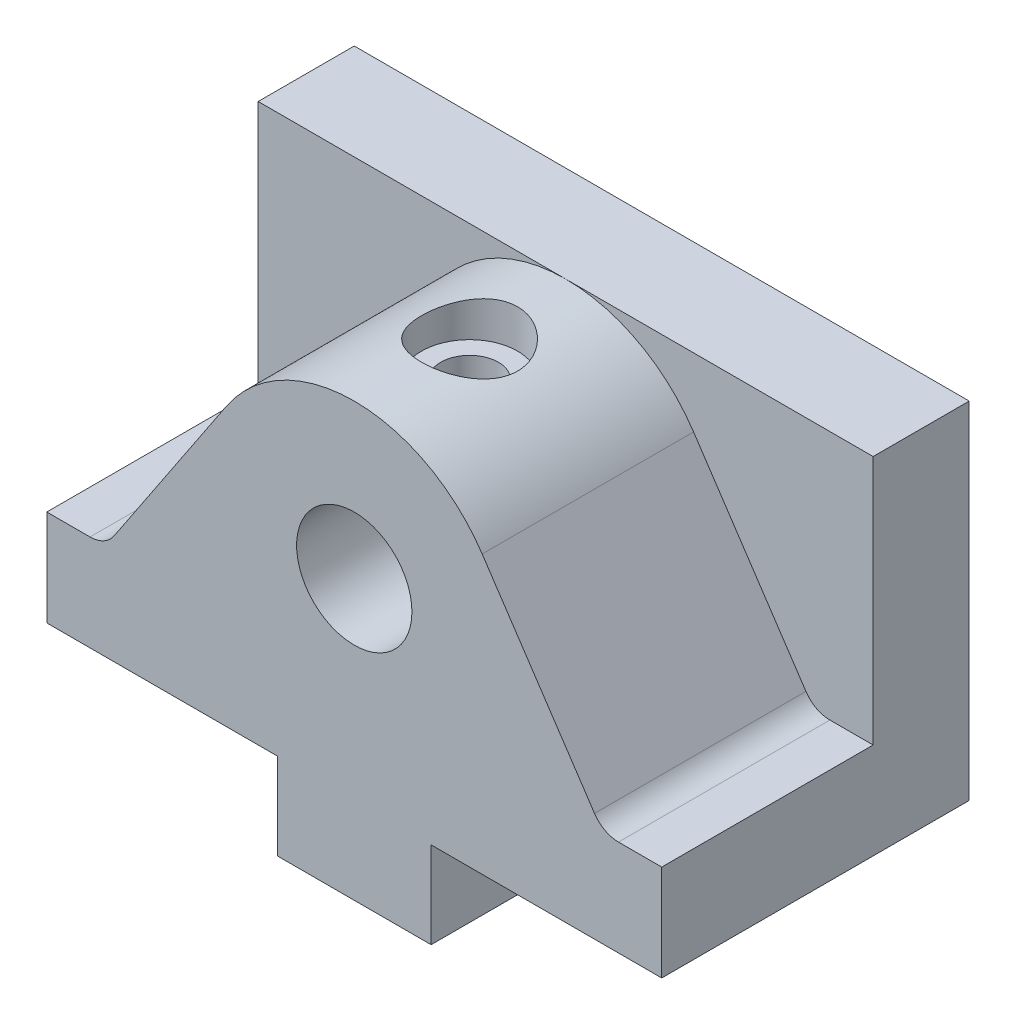
ISO-10303-21;
HEADER;
FILE_DESCRIPTION(('STEP AP214'),'2;1');
FILE_NAME('part.step','',(''),(''),'','','');
FILE_SCHEMA(('AUTOMOTIVE_DESIGN { 1 0 10303 214 1 1 1 1 }'));
ENDSEC;
DATA;
#1=APPLICATION_CONTEXT('core data for automotive mechanical design processes');
#2=APPLICATION_PROTOCOL_DEFINITION('international standard','automotive_design',2000,#1);
#3=PRODUCT_CONTEXT('',#1,'mechanical');
#4=PRODUCT('Part','Part','',(#3));
#5=PRODUCT_RELATED_PRODUCT_CATEGORY('part','',(#4));
#6=PRODUCT_DEFINITION_FORMATION('','',#4);
#7=PRODUCT_DEFINITION_CONTEXT('part definition',#1,'design');
#8=PRODUCT_DEFINITION('design','',#6,#7);
#9=PRODUCT_DEFINITION_SHAPE('','',#8);
#10=(LENGTH_UNIT() NAMED_UNIT(*) SI_UNIT(.MILLI.,.METRE.));
#11=(NAMED_UNIT(*) PLANE_ANGLE_UNIT() SI_UNIT($,.RADIAN.));
#12=(NAMED_UNIT(*) SI_UNIT($,.STERADIAN.) SOLID_ANGLE_UNIT());
#13=UNCERTAINTY_MEASURE_WITH_UNIT(LENGTH_MEASURE(1.E-05),#10,'distance_accuracy_value','');
#14=(GEOMETRIC_REPRESENTATION_CONTEXT(3) GLOBAL_UNCERTAINTY_ASSIGNED_CONTEXT((#13)) GLOBAL_UNIT_ASSIGNED_CONTEXT((#10,
#11,#12)) REPRESENTATION_CONTEXT('',''));
#15=CARTESIAN_POINT('',(0.,0.,0.));
#16=DIRECTION('',(0.,0.,1.));
#17=DIRECTION('',(1.,0.,0.));
#18=AXIS2_PLACEMENT_3D('',#15,#16,#17);
#19=CARTESIAN_POINT('',(0.,16.0000000000004,22.0000000000001));
#20=DIRECTION('',(0.,1.,0.));
#21=DIRECTION('',(-1.,0.,0.));
#22=AXIS2_PLACEMENT_3D('',#19,#20,#21);
#23=PLANE('',#22);
#24=DIRECTION('',(0.,0.,-1.));
#25=VECTOR('',#24,1.);
#26=CARTESIAN_POINT('',(8.00000000000001,16.0000000000004,22.0000000000001));
#27=LINE('',#26,#25);
#28=CARTESIAN_POINT('',(8.00000000000001,16.0000000000004,22.0000000000001));
#29=VERTEX_POINT('',#28);
#30=CARTESIAN_POINT('',(8.00000000000001,16.,-10.));
#31=VERTEX_POINT('',#30);
#32=EDGE_CURVE('E342',#29,#31,#27,.T.);
#33=ORIENTED_EDGE('',*,*,#32,.T.);
#34=DIRECTION('',(1.,0.,0.));
#35=VECTOR('',#34,1.);
#36=CARTESIAN_POINT('',(0.,16.,-9.99999999999999));
#37=LINE('',#36,#35);
#38=CARTESIAN_POINT('',(32.0000000000001,16.0000000000004,-9.99999999999999));
#39=VERTEX_POINT('',#38);
#40=EDGE_CURVE('E236',#31,#39,#37,.T.);
#41=ORIENTED_EDGE('',*,*,#40,.T.);
#42=DIRECTION('',(0.,0.,-1.));
#43=VECTOR('',#42,1.);
#44=CARTESIAN_POINT('',(32.0000000000001,16.0000000000005,22.0000000000001));
#45=LINE('',#44,#43);
#46=CARTESIAN_POINT('',(32.0000000000001,16.0000000000005,22.0000000000001));
#47=VERTEX_POINT('',#46);
#48=EDGE_CURVE('E338',#47,#39,#45,.T.);
#49=ORIENTED_EDGE('',*,*,#48,.F.);
#50=DIRECTION('',(1.,0.,0.));
#51=VECTOR('',#50,1.);
#52=CARTESIAN_POINT('',(0.,16.0000000000004,22.0000000000001));
#53=LINE('',#52,#51);
#54=EDGE_CURVE('E290',#29,#47,#53,.T.);
#55=ORIENTED_EDGE('',*,*,#54,.F.);
#56=EDGE_LOOP('',(#33,#41,#49,#55));
#57=FACE_BOUND('',#56,.T.);
#58=ADVANCED_FACE('F48',(#57),#23,.F.);
#59=CARTESIAN_POINT('',(-32.,16.0000000000004,-9.99999999999999));
#60=VERTEX_POINT('',#59);
#61=CARTESIAN_POINT('',(-8.,16.,-9.99999999999999));
#62=VERTEX_POINT('',#61);
#63=EDGE_CURVE('E237',#60,#62,#37,.T.);
#64=ORIENTED_EDGE('',*,*,#63,.T.);
#65=DIRECTION('',(0.,0.,-1.));
#66=VECTOR('',#65,1.);
#67=CARTESIAN_POINT('',(-8.,16.0000000000004,22.0000000000001));
#68=LINE('',#67,#66);
#69=CARTESIAN_POINT('',(-8.,16.0000000000004,22.0000000000001));
#70=VERTEX_POINT('',#69);
#71=EDGE_CURVE('E70',#70,#62,#68,.T.);
#72=ORIENTED_EDGE('',*,*,#71,.F.);
#73=CARTESIAN_POINT('',(-32.,16.0000000000004,22.0000000000001));
#74=VERTEX_POINT('',#73);
#75=EDGE_CURVE('E286',#74,#70,#53,.T.);
#76=ORIENTED_EDGE('',*,*,#75,.F.);
#77=DIRECTION('',(0.,0.,-1.));
#78=VECTOR('',#77,1.);
#79=CARTESIAN_POINT('',(-32.,16.0000000000004,22.0000000000001));
#80=LINE('',#79,#78);
#81=EDGE_CURVE('E353',#74,#60,#80,.T.);
#82=ORIENTED_EDGE('',*,*,#81,.T.);
#83=EDGE_LOOP('',(#64,#72,#76,#82));
#84=FACE_BOUND('',#83,.T.);
#85=ADVANCED_FACE('F451',(#84),#23,.F.);
#86=CARTESIAN_POINT('',(27.5,29.0000000000005,22.0000000000002));
#87=DIRECTION('',(0.,0.,-1.));
#88=DIRECTION('',(-1.,0.,0.));
#89=AXIS2_PLACEMENT_3D('',#86,#87,#88);
#90=CYLINDRICAL_SURFACE('',#89,3.);
#91=CARTESIAN_POINT('',(27.5,29.0000000000001,2.28983498828939E-13));
#92=DIRECTION('',(0.,0.,1.));
#93=DIRECTION('',(1.,0.,0.));
#94=AXIS2_PLACEMENT_3D('',#91,#92,#93);
#95=CIRCLE('',#94,3.);
#96=CARTESIAN_POINT('',(25.0037292554169,27.3360792177094,2.28983498828939E-13));
#97=VERTEX_POINT('',#96);
#98=CARTESIAN_POINT('',(27.5000000000001,26.0000000000001,2.28983498828939E-13));
#99=VERTEX_POINT('',#98);
#100=EDGE_CURVE('E258',#97,#99,#95,.T.);
#101=ORIENTED_EDGE('',*,*,#100,.F.);
#102=DIRECTION('',(0.,0.,-1.));
#103=VECTOR('',#102,1.);
#104=CARTESIAN_POINT('',(25.0037292554169,27.3360792177098,22.0000000000002));
#105=LINE('',#104,#103);
#106=CARTESIAN_POINT('',(25.0037292554169,27.3360792177098,22.0000000000002));
#107=VERTEX_POINT('',#106);
#108=EDGE_CURVE('E63',#107,#97,#105,.T.);
#109=ORIENTED_EDGE('',*,*,#108,.F.);
#110=CARTESIAN_POINT('',(27.5,29.0000000000005,22.0000000000002));
#111=DIRECTION('',(0.,0.,1.));
#112=DIRECTION('',(1.,0.,0.));
#113=AXIS2_PLACEMENT_3D('',#110,#111,#112);
#114=CIRCLE('',#113,3.);
#115=CARTESIAN_POINT('',(27.5000000000001,26.0000000000005,22.));
#116=VERTEX_POINT('',#115);
#117=EDGE_CURVE('E262',#107,#116,#114,.T.);
#118=ORIENTED_EDGE('',*,*,#117,.T.);
#119=DIRECTION('',(0.,0.,-1.));
#120=VECTOR('',#119,1.);
#121=CARTESIAN_POINT('',(27.5000000000001,26.0000000000005,22.));
#122=LINE('',#121,#120);
#123=EDGE_CURVE('E78',#116,#99,#122,.T.);
#124=ORIENTED_EDGE('',*,*,#123,.T.);
#125=EDGE_LOOP('',(#101,#109,#118,#124));
#126=FACE_BOUND('',#125,.T.);
#127=ADVANCED_FACE('F50',(#126),#90,.F.);
#128=CARTESIAN_POINT('',(29.9278310516533,19.948773651172,22.0000000000001));
#129=DIRECTION('',(0.832090248194357,0.554640260763546,0.));
#130=DIRECTION('',(-0.554640260763546,0.832090248194356,0.));
#131=AXIS2_PLACEMENT_3D('',#128,#129,#130);
#132=PLANE('',#131);
#133=DIRECTION('',(0.554640260763546,-0.832090248194357,0.));
#134=VECTOR('',#133,1.);
#135=CARTESIAN_POINT('',(29.9278310516533,19.9487736511716,3.40005801291454E-13));
#136=LINE('',#135,#134);
#137=CARTESIAN_POINT('',(13.3134439711097,44.8742441722167,0.));
#138=VERTEX_POINT('',#137);
#139=EDGE_CURVE('E311',#138,#97,#136,.T.);
#140=ORIENTED_EDGE('',*,*,#139,.F.);
#141=DIRECTION('',(0.,0.,-1.));
#142=VECTOR('',#141,1.);
#143=CARTESIAN_POINT('',(13.3134439711097,44.8742441722166,22.));
#144=LINE('',#143,#142);
#145=CARTESIAN_POINT('',(13.3134439711097,44.8742441722166,22.));
#146=VERTEX_POINT('',#145);
#147=EDGE_CURVE('E372',#146,#138,#144,.T.);
#148=ORIENTED_EDGE('',*,*,#147,.F.);
#149=DIRECTION('',(0.554640260763546,-0.832090248194357,0.));
#150=VECTOR('',#149,1.);
#151=CARTESIAN_POINT('',(29.9278310516533,19.948773651172,22.0000000000001));
#152=LINE('',#151,#150);
#153=EDGE_CURVE('E265',#146,#107,#152,.T.);
#154=ORIENTED_EDGE('',*,*,#153,.T.);
#155=ORIENTED_EDGE('',*,*,#108,.T.);
#156=EDGE_LOOP('',(#140,#148,#154,#155));
#157=FACE_BOUND('',#156,.T.);
#158=ADVANCED_FACE('F480',(#157),#132,.T.);
#159=CARTESIAN_POINT('',(0.,35.9999999999999,22.0000000000001));
#160=DIRECTION('',(0.,0.,-1.));
#161=DIRECTION('',(-1.,0.,0.));
#162=AXIS2_PLACEMENT_3D('',#159,#160,#161);
#163=CYLINDRICAL_SURFACE('',#162,16.);
#164=CARTESIAN_POINT('',(0.,52.,15.0000000000001));
#165=CARTESIAN_POINT('',(0.273756740698167,51.9999986351195,14.9999982136498));
#166=CARTESIAN_POINT('',(0.547532210011384,51.9929077993932,14.9774430922223));
#167=CARTESIAN_POINT('',(1.08707683835381,51.9653157635525,14.888055033843));
#168=CARTESIAN_POINT('',(1.35284417090375,51.9448115279957,14.8212120745425));
#169=CARTESIAN_POINT('',(1.86851417460312,51.8926326279151,14.6457225152173));
#170=CARTESIAN_POINT('',(2.11844070794279,51.8609752599559,14.5371406213887));
#171=CARTESIAN_POINT('',(2.59653920938618,51.7897587664486,14.2815307292862));
#172=CARTESIAN_POINT('',(2.82470774178096,51.7501983960149,14.1344966728758));
#173=CARTESIAN_POINT('',(3.25986133980771,51.6660085495921,13.8013760319327));
#174=CARTESIAN_POINT('',(3.46608011262117,51.6212686370069,13.6143164597634));
#175=CARTESIAN_POINT('',(3.84478952815339,51.5324018550408,13.2085264303382));
#176=CARTESIAN_POINT('',(4.01727389161514,51.4882751012093,12.9897900899934));
#177=CARTESIAN_POINT('',(4.32777345930639,51.4044457876485,12.5202217447927));
#178=CARTESIAN_POINT('',(4.4648313659311,51.3648795310219,12.2687300899923));
#179=CARTESIAN_POINT('',(4.69438964299238,51.2963120709364,11.7448307401774));
#180=CARTESIAN_POINT('',(4.78690175085854,51.2673080849027,11.4724285768566));
#181=CARTESIAN_POINT('',(4.92193839721857,51.224304279618,10.9230876901663));
#182=CARTESIAN_POINT('',(4.96588440031618,51.2098789171451,10.6465326254318));
#183=CARTESIAN_POINT('',(5.00698220147795,51.196402205673,10.0896275243652));
#184=CARTESIAN_POINT('',(5.00414643984176,51.1973467694717,9.80927851673902));
#185=CARTESIAN_POINT('',(4.9528729892982,51.2141275626545,9.26450215888891));
#186=CARTESIAN_POINT('',(4.90624231472935,51.2293736684468,8.99988349644805));
#187=CARTESIAN_POINT('',(4.7716325341796,51.2720810247009,8.48243137375097));
#188=CARTESIAN_POINT('',(4.68364903377188,51.2995435733467,8.2295991691417));
#189=CARTESIAN_POINT('',(4.46755498726522,51.3640417609541,7.7385922223016));
#190=CARTESIAN_POINT('',(4.33887702648705,51.4012113865355,7.50068555724068));
#191=CARTESIAN_POINT('',(4.04544082951013,51.4808742631001,7.04924892847485));
#192=CARTESIAN_POINT('',(3.88067322086207,51.523368895754,6.83572531898278));
#193=CARTESIAN_POINT('',(3.51086781672959,51.6112611120491,6.42890022633451));
#194=CARTESIAN_POINT('',(3.30433828237155,51.6567027842356,6.23696176888191));
#195=CARTESIAN_POINT('',(2.86145763238181,51.7436628303752,5.89011242568061));
#196=CARTESIAN_POINT('',(2.625104309396,51.7851809135328,5.73520428312298));
#197=CARTESIAN_POINT('',(2.12665844186189,51.8600517956098,5.46588924559507));
#198=CARTESIAN_POINT('',(1.86437962767712,51.8933384259288,5.35180745814416));
#199=CARTESIAN_POINT('',(1.32307191113053,51.9475182331415,5.16978799659368));
#200=CARTESIAN_POINT('',(1.04404812289842,51.968415173006,5.1018363110464));
#201=CARTESIAN_POINT('',(0.48874062916138,51.9948555758007,5.01632782968409));
#202=CARTESIAN_POINT('',(0.212767395155366,52.0009609158174,4.9969258256259));
#203=CARTESIAN_POINT('',(-0.338521222930357,51.9987919892392,5.00386490654931));
#204=CARTESIAN_POINT('',(-0.613836697226052,51.9905198232454,5.03019930929044));
#205=CARTESIAN_POINT('',(-1.1488773319034,51.9608945507905,5.12638237042554));
#206=CARTESIAN_POINT('',(-1.40881991368374,51.9398717244274,5.19513307044994));
#207=CARTESIAN_POINT('',(-1.91340771544551,51.8872048551715,5.37285740946686));
#208=CARTESIAN_POINT('',(-2.15805104179625,51.8555595005738,5.48183601610005));
#209=CARTESIAN_POINT('',(-2.63172962668877,51.783941710377,5.73989286619474));
#210=CARTESIAN_POINT('',(-2.86023895915116,51.7437850727066,5.88988394998723));
#211=CARTESIAN_POINT('',(-3.28946340384104,51.659736400137,6.22461284046969));
#212=CARTESIAN_POINT('',(-3.49017095217581,51.6158433539155,6.40936007097856));
#213=CARTESIAN_POINT('',(-3.8663498516761,51.5270797953256,6.81703556020839));
#214=CARTESIAN_POINT('',(-4.04050609358126,51.4822394682575,7.04118665495688));
#215=CARTESIAN_POINT('',(-4.34885000980606,51.3984778838241,7.51650646550709));
#216=CARTESIAN_POINT('',(-4.4830383189372,51.3595565324524,7.76767475210794));
#217=CARTESIAN_POINT('',(-4.70680333922171,51.2924712932347,8.28938069148192));
#218=CARTESIAN_POINT('',(-4.79655278224052,51.2642658542748,8.55983859774289));
#219=CARTESIAN_POINT('',(-4.92891577272362,51.2220468337723,9.11308997299448));
#220=CARTESIAN_POINT('',(-4.9715472565598,51.2080278520491,9.39587870537414));
#221=CARTESIAN_POINT('',(-5.00717624632505,51.1963317085551,9.95201635032173));
#222=CARTESIAN_POINT('',(-5.00233118486545,51.1979441840055,10.2252138153897));
#223=CARTESIAN_POINT('',(-4.94835272515337,51.215603615036,10.7666983397678));
#224=CARTESIAN_POINT('',(-4.8992213929005,51.2316498972642,11.0349856275469));
#225=CARTESIAN_POINT('',(-4.75950919654472,51.2758725673356,11.5551761583676));
#226=CARTESIAN_POINT('',(-4.66954569624034,51.3038679276101,11.8072617643735));
#227=CARTESIAN_POINT('',(-4.45120909339999,51.3687881701824,12.2929616541361));
#228=CARTESIAN_POINT('',(-4.32282817776949,51.4057148685869,12.5265721683136));
#229=CARTESIAN_POINT('',(-4.02542700053973,51.4861394813401,12.9785838817593));
#230=CARTESIAN_POINT('',(-3.85501334096526,51.5298379569182,13.196032518001));
#231=CARTESIAN_POINT('',(-3.48083598561918,51.6179599528483,13.5999453124481));
#232=CARTESIAN_POINT('',(-3.27706336937758,51.6623836642662,13.7864011559644));
#233=CARTESIAN_POINT('',(-2.8339466512934,51.7486908780989,14.1291301534518));
#234=CARTESIAN_POINT('',(-2.59365829794949,51.7904440692268,14.2842189457998));
#235=CARTESIAN_POINT('',(-2.08911655205455,51.865070771875,14.5515956605579));
#236=CARTESIAN_POINT('',(-1.82487263118179,51.8979477726329,14.6639004085675));
#237=CARTESIAN_POINT('',(-1.30299054149593,51.9488260293388,14.834365470434));
#238=CARTESIAN_POINT('',(-1.04668134845017,51.9678496322455,14.8962994692214));
#239=CARTESIAN_POINT('',(-0.526919581760957,51.9934360136192,14.9791134398709));
#240=CARTESIAN_POINT('',(-0.263468464558675,52.0000013135858,15.0000017192161));
#241=CARTESIAN_POINT('',(0.,52.,15.0000000000001));
#242=B_SPLINE_CURVE_WITH_KNOTS('',3,(#164,#165,#166,#167,#168,#169,#170,#171,#172,#173,#174,
#175,#176,#177,#178,#179,#180,#181,#182,#183,#184,#185,#186,#187,#188,#189,#190,#191,#192,#193,
#194,#195,#196,#197,#198,#199,#200,#201,#202,#203,#204,#205,#206,#207,#208,#209,#210,#211,#212,
#213,#214,#215,#216,#217,#218,#219,#220,#221,#222,#223,#224,#225,#226,#227,#228,#229,#230,#231,
#232,#233,#234,#235,#236,#237,#238,#239,#240,#241),.UNSPECIFIED.,.T.,.F.,(4,2,2,2,2,2,2,2,2,2,2,
2,2,2,2,2,2,2,2,2,2,2,2,2,2,2,2,2,2,2,2,2,2,2,2,2,2,2,4),(0.,0.820301797730028,1.64078929339625,
2.46000991680973,3.27935968623354,4.12151288780634,4.96382269725109,5.82695084991457,
6.68985145121468,7.526766006722,8.36345801183914,9.16707669695201,9.97078079925609,
10.7862257089154,11.6018826405079,12.4546698912776,13.3075202966257,14.1670184276844,
15.0262553798757,15.8523027420231,16.6782294260681,17.4836250690085,18.2891202014736,
19.1142529896273,19.939609828464,20.7976711486192,21.6557188394421,22.5104046302278,
23.3647649559872,24.1804881394267,24.9961732705189,25.7999165363424,26.6038233736825,
27.43918056073,28.2747614954092,29.1376267255321,30.0001522671291,30.7897854665372,
31.5792588309975),.UNSPECIFIED.);
#243=CARTESIAN_POINT('',(0.,52.,15.0000000000001));
#244=VERTEX_POINT('',#243);
#245=EDGE_CURVE('E11',#244,#244,#242,.T.);
#246=ORIENTED_EDGE('',*,*,#245,.F.);
#247=EDGE_LOOP('',(#246));
#248=FACE_BOUND('',#247,.T.);
#249=CARTESIAN_POINT('',(0.,36.,0.));
#250=DIRECTION('',(0.,0.,1.));
#251=DIRECTION('',(1.,0.,0.));
#252=AXIS2_PLACEMENT_3D('',#249,#250,#251);
#253=CIRCLE('',#252,16.);
#254=CARTESIAN_POINT('',(-13.3134439711097,44.8742441722169,0.));
#255=VERTEX_POINT('',#254);
#256=CARTESIAN_POINT('',(0.,52.,0.));
#257=VERTEX_POINT('',#256);
#258=EDGE_CURVE('E315',#255,#257,#253,.F.);
#259=ORIENTED_EDGE('',*,*,#258,.F.);
#260=DIRECTION('',(0.,0.,-1.));
#261=VECTOR('',#260,1.);
#262=CARTESIAN_POINT('',(-13.3134439711097,44.8742441722167,22.));
#263=LINE('',#262,#261);
#264=CARTESIAN_POINT('',(-13.3134439711097,44.8742441722167,22.));
#265=VERTEX_POINT('',#264);
#266=EDGE_CURVE('E368',#265,#255,#263,.T.);
#267=ORIENTED_EDGE('',*,*,#266,.F.);
#268=CARTESIAN_POINT('',(0.,35.9999999999999,22.0000000000001));
#269=DIRECTION('',(0.,0.,1.));
#270=DIRECTION('',(1.,0.,0.));
#271=AXIS2_PLACEMENT_3D('',#268,#269,#270);
#272=CIRCLE('',#271,16.);
#273=EDGE_CURVE('E270',#265,#146,#272,.F.);
#274=ORIENTED_EDGE('',*,*,#273,.T.);
#275=ORIENTED_EDGE('',*,*,#147,.T.);
#276=EDGE_CURVE('E314',#257,#138,#253,.F.);
#277=ORIENTED_EDGE('',*,*,#276,.F.);
#278=EDGE_LOOP('',(#259,#267,#274,#275,#277));
#279=FACE_BOUND('',#278,.T.);
#280=ADVANCED_FACE('F383',(#248,#279),#163,.T.);
#281=CARTESIAN_POINT('',(-29.9278310516533,19.9487736511719,22.0000000000001));
#282=DIRECTION('',(0.832090248194357,-0.554640260763546,0.));
#283=DIRECTION('',(0.554640260763546,0.832090248194357,0.));
#284=AXIS2_PLACEMENT_3D('',#281,#282,#283);
#285=PLANE('',#284);
#286=DIRECTION('',(-0.554640260763546,-0.832090248194357,0.));
#287=VECTOR('',#286,1.);
#288=CARTESIAN_POINT('',(-29.9278310516533,19.9487736511715,3.40005801291454E-13));
#289=LINE('',#288,#287);
#290=CARTESIAN_POINT('',(-25.0037292554169,27.3360792177094,2.28983498828939E-13));
#291=VERTEX_POINT('',#290);
#292=EDGE_CURVE('E318',#255,#291,#289,.T.);
#293=ORIENTED_EDGE('',*,*,#292,.T.);
#294=DIRECTION('',(0.,0.,-1.));
#295=VECTOR('',#294,1.);
#296=CARTESIAN_POINT('',(-25.0037292554169,27.3360792177094,22.0000000000002));
#297=LINE('',#296,#295);
#298=CARTESIAN_POINT('',(-25.0037292554169,27.3360792177094,22.0000000000002));
#299=VERTEX_POINT('',#298);
#300=EDGE_CURVE('E364',#299,#291,#297,.T.);
#301=ORIENTED_EDGE('',*,*,#300,.F.);
#302=DIRECTION('',(-0.554640260763546,-0.832090248194357,0.));
#303=VECTOR('',#302,1.);
#304=CARTESIAN_POINT('',(-29.9278310516533,19.9487736511719,22.0000000000001));
#305=LINE('',#304,#303);
#306=EDGE_CURVE('E274',#265,#299,#305,.T.);
#307=ORIENTED_EDGE('',*,*,#306,.F.);
#308=ORIENTED_EDGE('',*,*,#266,.T.);
#309=EDGE_LOOP('',(#293,#301,#307,#308));
#310=FACE_BOUND('',#309,.T.);
#311=ADVANCED_FACE('F473',(#310),#285,.F.);
#312=CARTESIAN_POINT('',(-27.5,29.,22.0000000000002));
#313=DIRECTION('',(0.,0.,-1.));
#314=DIRECTION('',(-1.,0.,0.));
#315=AXIS2_PLACEMENT_3D('',#312,#313,#314);
#316=CYLINDRICAL_SURFACE('',#315,3.);
#317=CARTESIAN_POINT('',(-27.5,29.,2.28983498828939E-13));
#318=DIRECTION('',(0.,0.,1.));
#319=DIRECTION('',(1.,0.,0.));
#320=AXIS2_PLACEMENT_3D('',#317,#318,#319);
#321=CIRCLE('',#320,3.);
#322=CARTESIAN_POINT('',(-27.5,26.,2.28983498828939E-13));
#323=VERTEX_POINT('',#322);
#324=EDGE_CURVE('E322',#291,#323,#321,.F.);
#325=ORIENTED_EDGE('',*,*,#324,.T.);
#326=DIRECTION('',(0.,0.,-1.));
#327=VECTOR('',#326,1.);
#328=CARTESIAN_POINT('',(-27.5,26.,22.));
#329=LINE('',#328,#327);
#330=CARTESIAN_POINT('',(-27.5,26.,22.));
#331=VERTEX_POINT('',#330);
#332=EDGE_CURVE('E360',#331,#323,#329,.T.);
#333=ORIENTED_EDGE('',*,*,#332,.F.);
#334=CARTESIAN_POINT('',(-27.5,29.,22.0000000000002));
#335=DIRECTION('',(0.,0.,1.));
#336=DIRECTION('',(1.,0.,0.));
#337=AXIS2_PLACEMENT_3D('',#334,#335,#336);
#338=CIRCLE('',#337,3.);
#339=EDGE_CURVE('E277',#299,#331,#338,.F.);
#340=ORIENTED_EDGE('',*,*,#339,.F.);
#341=ORIENTED_EDGE('',*,*,#300,.T.);
#342=EDGE_LOOP('',(#325,#333,#340,#341));
#343=FACE_BOUND('',#342,.T.);
#344=ADVANCED_FACE('F470',(#343),#316,.F.);
#345=CARTESIAN_POINT('',(0.,26.0000000000004,22.));
#346=DIRECTION('',(0.,-1.,0.));
#347=DIRECTION('',(1.,0.,0.));
#348=AXIS2_PLACEMENT_3D('',#345,#346,#347);
#349=PLANE('',#348);
#350=DIRECTION('',(-1.,0.,0.));
#351=VECTOR('',#350,1.);
#352=CARTESIAN_POINT('',(0.,26.,2.28983498828939E-13));
#353=LINE('',#352,#351);
#354=CARTESIAN_POINT('',(-32.,26.,2.28983498828939E-13));
#355=VERTEX_POINT('',#354);
#356=EDGE_CURVE('E326',#323,#355,#353,.T.);
#357=ORIENTED_EDGE('',*,*,#356,.T.);
#358=DIRECTION('',(0.,0.,-1.));
#359=VECTOR('',#358,1.);
#360=CARTESIAN_POINT('',(-32.,26.0000000000005,22.));
#361=LINE('',#360,#359);
#362=CARTESIAN_POINT('',(-32.,26.0000000000005,22.));
#363=VERTEX_POINT('',#362);
#364=EDGE_CURVE('E356',#363,#355,#361,.T.);
#365=ORIENTED_EDGE('',*,*,#364,.F.);
#366=DIRECTION('',(-1.,0.,0.));
#367=VECTOR('',#366,1.);
#368=CARTESIAN_POINT('',(0.,26.0000000000004,22.));
#369=LINE('',#368,#367);
#370=EDGE_CURVE('E280',#331,#363,#369,.T.);
#371=ORIENTED_EDGE('',*,*,#370,.F.);
#372=ORIENTED_EDGE('',*,*,#332,.T.);
#373=EDGE_LOOP('',(#357,#365,#371,#372));
#374=FACE_BOUND('',#373,.T.);
#375=ADVANCED_FACE('F466',(#374),#349,.F.);
#376=CARTESIAN_POINT('',(-32.,4.57966997657877E-13,22.0000000000001));
#377=DIRECTION('',(1.,0.,0.));
#378=DIRECTION('',(0.,1.,0.));
#379=AXIS2_PLACEMENT_3D('',#376,#377,#378);
#380=PLANE('',#379);
#381=ORIENTED_EDGE('',*,*,#364,.T.);
#382=DIRECTION('',(0.,-1.,0.));
#383=VECTOR('',#382,1.);
#384=CARTESIAN_POINT('',(-32.,4.44089209850063E-13,0.));
#385=LINE('',#384,#383);
#386=CARTESIAN_POINT('',(-32.,52.,0.));
#387=VERTEX_POINT('',#386);
#388=EDGE_CURVE('E249',#387,#355,#385,.T.);
#389=ORIENTED_EDGE('',*,*,#388,.F.);
#390=DIRECTION('',(0.,0.,1.));
#391=VECTOR('',#390,1.);
#392=CARTESIAN_POINT('',(-32.,51.9999999999999,-9.99999999999999));
#393=LINE('',#392,#391);
#394=CARTESIAN_POINT('',(-32.,51.9999999999999,-9.99999999999999));
#395=VERTEX_POINT('',#394);
#396=EDGE_CURVE('E244',#395,#387,#393,.T.);
#397=ORIENTED_EDGE('',*,*,#396,.F.);
#398=DIRECTION('',(0.,-1.,0.));
#399=VECTOR('',#398,1.);
#400=CARTESIAN_POINT('',(-32.,4.44089209850063E-13,-10.));
#401=LINE('',#400,#399);
#402=EDGE_CURVE('E231',#395,#60,#401,.T.);
#403=ORIENTED_EDGE('',*,*,#402,.T.);
#404=ORIENTED_EDGE('',*,*,#81,.F.);
#405=DIRECTION('',(0.,-1.,0.));
#406=VECTOR('',#405,1.);
#407=CARTESIAN_POINT('',(-32.,4.57966997657877E-13,22.0000000000001));
#408=LINE('',#407,#406);
#409=EDGE_CURVE('E283',#363,#74,#408,.T.);
#410=ORIENTED_EDGE('',*,*,#409,.F.);
#411=EDGE_LOOP('',(#381,#389,#397,#403,#404,#410));
#412=FACE_BOUND('',#411,.T.);
#413=ADVANCED_FACE('F463',(#412),#380,.F.);
#414=CARTESIAN_POINT('',(-7.99999999999999,4.31078783780237E-13,22.0000000000001));
#415=DIRECTION('',(1.,0.,0.));
#416=DIRECTION('',(0.,1.,0.));
#417=AXIS2_PLACEMENT_3D('',#414,#415,#416);
#418=PLANE('',#417);
#419=ORIENTED_EDGE('',*,*,#71,.T.);
#420=DIRECTION('',(0.,-1.,0.));
#421=VECTOR('',#420,1.);
#422=CARTESIAN_POINT('',(-8.,6.99999999999999,-10.));
#423=LINE('',#422,#421);
#424=CARTESIAN_POINT('',(-8.,6.99999999999999,-10.));
#425=VERTEX_POINT('',#424);
#426=EDGE_CURVE('E212',#62,#425,#423,.T.);
#427=ORIENTED_EDGE('',*,*,#426,.T.);
#428=DIRECTION('',(0.,0.,-1.));
#429=VECTOR('',#428,1.);
#430=CARTESIAN_POINT('',(-8.,7.00000000000045,22.));
#431=LINE('',#430,#429);
#432=CARTESIAN_POINT('',(-8.,7.00000000000045,22.));
#433=VERTEX_POINT('',#432);
#434=EDGE_CURVE('E348',#433,#425,#431,.T.);
#435=ORIENTED_EDGE('',*,*,#434,.F.);
#436=DIRECTION('',(0.,-1.,0.));
#437=VECTOR('',#436,1.);
#438=CARTESIAN_POINT('',(-7.99999999999999,4.31078783780237E-13,22.0000000000001));
#439=LINE('',#438,#437);
#440=EDGE_CURVE('E289',#70,#433,#439,.T.);
#441=ORIENTED_EDGE('',*,*,#440,.F.);
#442=EDGE_LOOP('',(#419,#427,#435,#441));
#443=FACE_BOUND('',#442,.T.);
#444=ADVANCED_FACE('F459',(#443),#418,.F.);
#445=CARTESIAN_POINT('',(0.,7.00000000000045,22.));
#446=DIRECTION('',(0.,1.,0.));
#447=DIRECTION('',(-1.,0.,0.));
#448=AXIS2_PLACEMENT_3D('',#445,#446,#447);
#449=PLANE('',#448);
#450=CARTESIAN_POINT('',(0.,7.00000000000045,14.));
#451=DIRECTION('',(0.,-1.,0.));
#452=DIRECTION('',(0.,0.,-1.));
#453=AXIS2_PLACEMENT_3D('',#450,#451,#452);
#454=CIRCLE('',#453,3.025);
#455=CARTESIAN_POINT('',(0.,7.00000000000045,10.975));
#456=VERTEX_POINT('',#455);
#457=EDGE_CURVE('E200',#456,#456,#454,.T.);
#458=ORIENTED_EDGE('',*,*,#457,.F.);
#459=EDGE_LOOP('',(#458));
#460=FACE_BOUND('',#459,.T.);
#461=CARTESIAN_POINT('',(0.,6.99999999999998,-2.));
#462=DIRECTION('',(0.,-1.,0.));
#463=DIRECTION('',(0.,0.,-1.));
#464=AXIS2_PLACEMENT_3D('',#461,#462,#463);
#465=CIRCLE('',#464,3.025);
#466=CARTESIAN_POINT('',(0.,6.99999999999998,-5.025));
#467=VERTEX_POINT('',#466);
#468=EDGE_CURVE('E190',#467,#467,#465,.T.);
#469=ORIENTED_EDGE('',*,*,#468,.F.);
#470=EDGE_LOOP('',(#469));
#471=FACE_BOUND('',#470,.T.);
#472=ORIENTED_EDGE('',*,*,#434,.T.);
#473=DIRECTION('',(1.,0.,0.));
#474=VECTOR('',#473,1.);
#475=CARTESIAN_POINT('',(8.00000000000001,7.00000000000001,-10.));
#476=LINE('',#475,#474);
#477=CARTESIAN_POINT('',(8.00000000000001,7.00000000000001,-10.));
#478=VERTEX_POINT('',#477);
#479=EDGE_CURVE('E215',#425,#478,#476,.T.);
#480=ORIENTED_EDGE('',*,*,#479,.T.);
#481=DIRECTION('',(0.,0.,-1.));
#482=VECTOR('',#481,1.);
#483=CARTESIAN_POINT('',(8.00000000000001,7.00000000000045,22.));
#484=LINE('',#483,#482);
#485=CARTESIAN_POINT('',(8.00000000000001,7.00000000000045,22.));
#486=VERTEX_POINT('',#485);
#487=EDGE_CURVE('E345',#486,#478,#484,.T.);
#488=ORIENTED_EDGE('',*,*,#487,.F.);
#489=DIRECTION('',(1.,0.,0.));
#490=VECTOR('',#489,1.);
#491=CARTESIAN_POINT('',(0.,7.00000000000045,22.));
#492=LINE('',#491,#490);
#493=EDGE_CURVE('E293',#433,#486,#492,.T.);
#494=ORIENTED_EDGE('',*,*,#493,.F.);
#495=EDGE_LOOP('',(#472,#480,#488,#494));
#496=FACE_BOUND('',#495,.T.);
#497=ADVANCED_FACE('F455',(#460,#471,#496),#449,.F.);
#498=CARTESIAN_POINT('',(8.,4.57966997657877E-13,22.0000000000001));
#499=DIRECTION('',(-1.,0.,0.));
#500=DIRECTION('',(0.,-1.,0.));
#501=AXIS2_PLACEMENT_3D('',#498,#499,#500);
#502=PLANE('',#501);
#503=ORIENTED_EDGE('',*,*,#487,.T.);
#504=DIRECTION('',(0.,1.,0.));
#505=VECTOR('',#504,1.);
#506=CARTESIAN_POINT('',(8.00000000000001,16.,-10.));
#507=LINE('',#506,#505);
#508=EDGE_CURVE('E211',#478,#31,#507,.T.);
#509=ORIENTED_EDGE('',*,*,#508,.T.);
#510=ORIENTED_EDGE('',*,*,#32,.F.);
#511=DIRECTION('',(0.,1.,0.));
#512=VECTOR('',#511,1.);
#513=CARTESIAN_POINT('',(8.,4.57966997657877E-13,22.0000000000001));
#514=LINE('',#513,#512);
#515=EDGE_CURVE('E296',#486,#29,#514,.T.);
#516=ORIENTED_EDGE('',*,*,#515,.F.);
#517=EDGE_LOOP('',(#503,#509,#510,#516));
#518=FACE_BOUND('',#517,.T.);
#519=ADVANCED_FACE('F447',(#518),#502,.F.);
#520=CARTESIAN_POINT('',(32.,4.58834359395865E-13,22.0000000000001));
#521=DIRECTION('',(-1.,0.,0.));
#522=DIRECTION('',(0.,-1.,0.));
#523=AXIS2_PLACEMENT_3D('',#520,#521,#522);
#524=PLANE('',#523);
#525=ORIENTED_EDGE('',*,*,#48,.T.);
#526=DIRECTION('',(0.,1.,0.));
#527=VECTOR('',#526,1.);
#528=CARTESIAN_POINT('',(32.,4.58834359395865E-13,-10.));
#529=LINE('',#528,#527);
#530=CARTESIAN_POINT('',(32.0000000000001,52.0000000000008,-9.99999999999999));
#531=VERTEX_POINT('',#530);
#532=EDGE_CURVE('E240',#39,#531,#529,.T.);
#533=ORIENTED_EDGE('',*,*,#532,.T.);
#534=DIRECTION('',(0.,0.,1.));
#535=VECTOR('',#534,1.);
#536=CARTESIAN_POINT('',(32.0000000000001,52.0000000000008,-9.99999999999999));
#537=LINE('',#536,#535);
#538=CARTESIAN_POINT('',(32.0000000000001,52.0000000000009,0.));
#539=VERTEX_POINT('',#538);
#540=EDGE_CURVE('E254',#531,#539,#537,.T.);
#541=ORIENTED_EDGE('',*,*,#540,.T.);
#542=DIRECTION('',(0.,1.,0.));
#543=VECTOR('',#542,1.);
#544=CARTESIAN_POINT('',(32.,0.,0.));
#545=LINE('',#544,#543);
#546=CARTESIAN_POINT('',(32.,26.0000000000001,2.28983498828939E-13));
#547=VERTEX_POINT('',#546);
#548=EDGE_CURVE('E232',#547,#539,#545,.T.);
#549=ORIENTED_EDGE('',*,*,#548,.F.);
#550=DIRECTION('',(0.,0.,-1.));
#551=VECTOR('',#550,1.);
#552=CARTESIAN_POINT('',(32.,26.0000000000005,22.));
#553=LINE('',#552,#551);
#554=CARTESIAN_POINT('',(32.,26.0000000000005,22.));
#555=VERTEX_POINT('',#554);
#556=EDGE_CURVE('E334',#555,#547,#553,.T.);
#557=ORIENTED_EDGE('',*,*,#556,.F.);
#558=DIRECTION('',(0.,1.,0.));
#559=VECTOR('',#558,1.);
#560=CARTESIAN_POINT('',(32.,4.58834359395865E-13,22.0000000000001));
#561=LINE('',#560,#559);
#562=EDGE_CURVE('E299',#47,#555,#561,.T.);
#563=ORIENTED_EDGE('',*,*,#562,.F.);
#564=EDGE_LOOP('',(#525,#533,#541,#549,#557,#563));
#565=FACE_BOUND('',#564,.T.);
#566=ADVANCED_FACE('F444',(#565),#524,.F.);
#567=CARTESIAN_POINT('',(0.,26.0000000000004,22.));
#568=DIRECTION('',(0.,1.,0.));
#569=DIRECTION('',(-1.,0.,0.));
#570=AXIS2_PLACEMENT_3D('',#567,#568,#569);
#571=PLANE('',#570);
#572=DIRECTION('',(1.,0.,0.));
#573=VECTOR('',#572,1.);
#574=CARTESIAN_POINT('',(0.,25.9999999999999,2.28983498828939E-13));
#575=LINE('',#574,#573);
#576=EDGE_CURVE('E266',#99,#547,#575,.T.);
#577=ORIENTED_EDGE('',*,*,#576,.F.);
#578=ORIENTED_EDGE('',*,*,#123,.F.);
#579=DIRECTION('',(1.,0.,0.));
#580=VECTOR('',#579,1.);
#581=CARTESIAN_POINT('',(0.,26.0000000000004,22.));
#582=LINE('',#581,#580);
#583=EDGE_CURVE('E302',#116,#555,#582,.T.);
#584=ORIENTED_EDGE('',*,*,#583,.T.);
#585=ORIENTED_EDGE('',*,*,#556,.T.);
#586=EDGE_LOOP('',(#577,#578,#584,#585));
#587=FACE_BOUND('',#586,.T.);
#588=ADVANCED_FACE('F440',(#587),#571,.T.);
#589=CARTESIAN_POINT('',(0.,35.9999999999999,22.0000000000001));
#590=DIRECTION('',(0.,0.,-1.));
#591=DIRECTION('',(-1.,0.,0.));
#592=AXIS2_PLACEMENT_3D('',#589,#590,#591);
#593=CYLINDRICAL_SURFACE('',#592,6.);
#594=CARTESIAN_POINT('',(0.,42.,13.));
#595=CARTESIAN_POINT('',(-0.0788941476270631,41.9999993496415,12.9999991612595));
#596=CARTESIAN_POINT('',(-0.157796620407921,41.9984386900238,12.9968820545245));
#597=CARTESIAN_POINT('',(-0.315001991255891,41.9922435879324,12.98446072826));
#598=CARTESIAN_POINT('',(-0.393304603620504,41.9876077629569,12.9751537259346));
#599=CARTESIAN_POINT('',(-0.626628691373715,41.9692197802747,12.9380421431814));
#600=CARTESIAN_POINT('',(-0.779952894844964,41.950987344555,12.9010471709373));
#601=CARTESIAN_POINT('',(-1.07683586335995,41.9044896674308,12.8044182255708));
#602=CARTESIAN_POINT('',(-1.22043005484383,41.8762634436567,12.7448722337917));
#603=CARTESIAN_POINT('',(-1.49540820515374,41.8123730271632,12.6052887493212));
#604=CARTESIAN_POINT('',(-1.62679312559149,41.7767094209369,12.5252528722967));
#605=CARTESIAN_POINT('',(-1.88252701271779,41.6986875229893,12.3414460191505));
#606=CARTESIAN_POINT('',(-2.0059694541685,41.656054745866,12.2365320524787));
#607=CARTESIAN_POINT('',(-2.23433451090185,41.5698003362932,12.0084440785135));
#608=CARTESIAN_POINT('',(-2.33924301355732,41.5261779786051,11.8852562868348));
#609=CARTESIAN_POINT('',(-2.5357686472225,41.4389634796958,11.6125156399183));
#610=CARTESIAN_POINT('',(-2.62572411176602,41.3956360268672,11.4616590255418));
#611=CARTESIAN_POINT('',(-2.74034031450291,41.3378244971938,11.2240491459768));
#612=CARTESIAN_POINT('',(-2.77516786882118,41.3197457084023,11.1429290754373));
#613=CARTESIAN_POINT('',(-2.83769299596486,41.2866576836528,10.9773994201196));
#614=CARTESIAN_POINT('',(-2.86539478083938,41.271646635434,10.8929918127424));
#615=CARTESIAN_POINT('',(-2.91188280266507,41.2461034170808,10.7266042032378));
#616=CARTESIAN_POINT('',(-2.93110042292909,41.2353583856519,10.6447772032435));
#617=CARTESIAN_POINT('',(-2.96263559384681,41.2175778415113,10.4794450914804));
#618=CARTESIAN_POINT('',(-2.97495680535111,41.2105403608211,10.3959408944593));
#619=CARTESIAN_POINT('',(-2.99251382412707,41.2004775664526,10.2279936325838));
#620=CARTESIAN_POINT('',(-2.9977538985794,41.1974498364709,10.1435511641063));
#621=CARTESIAN_POINT('',(-3.00108452416057,41.1955255596718,9.97450634565857));
#622=CARTESIAN_POINT('',(-2.99917575741612,41.1966286187036,9.88990401171215));
#623=CARTESIAN_POINT('',(-2.98404973540406,41.2053466805928,9.65724610167769));
#624=CARTESIAN_POINT('',(-2.96335042632725,41.2172679435373,9.50975584584562));
#625=CARTESIAN_POINT('',(-2.90082280036695,41.252281824121,9.22080632317493));
#626=CARTESIAN_POINT('',(-2.85898775295597,41.2753780002338,9.07934899304936));
#627=CARTESIAN_POINT('',(-2.75462843937306,41.3306256888873,8.80232034970317));
#628=CARTESIAN_POINT('',(-2.69164495870316,41.3629755956798,8.66696288824884));
#629=CARTESIAN_POINT('',(-2.54712530575799,41.4331017525129,8.40809503668594));
#630=CARTESIAN_POINT('',(-2.46558080007526,41.4708804371131,8.28459000351952));
#631=CARTESIAN_POINT('',(-2.27419808739748,41.5533948568688,8.0364369062202));
#632=CARTESIAN_POINT('',(-2.16208335434884,41.5984053392497,7.91362955761588));
#633=CARTESIAN_POINT('',(-1.918666756993,41.6864286668494,7.68779356579792));
#634=CARTESIAN_POINT('',(-1.7873557754036,41.7294405499669,7.58477437509413));
#635=CARTESIAN_POINT('',(-1.50154951155103,41.8110596276946,7.39694306798136));
#636=CARTESIAN_POINT('',(-1.34626077321059,41.8493695273187,7.3131985963024));
#637=CARTESIAN_POINT('',(-1.02139864805272,41.9147364311805,7.17370889924217));
#638=CARTESIAN_POINT('',(-0.851836729203666,41.9418023676751,7.11794144145034));
#639=CARTESIAN_POINT('',(-0.51829947460802,41.9797300128223,7.04057379206389));
#640=CARTESIAN_POINT('',(-0.355024591545094,41.9917481491935,7.01652629361826));
#641=CARTESIAN_POINT('',(-0.0263387999478455,42.0021904036187,6.99560580573833));
#642=CARTESIAN_POINT('',(0.139071059584298,42.0006209616012,6.99871994286047));
#643=CARTESIAN_POINT('',(0.453698915981459,41.9847357676384,7.0306200654602));
#644=CARTESIAN_POINT('',(0.603178224155141,41.9714173706496,7.05739759824394));
#645=CARTESIAN_POINT('',(0.895220676900481,41.9346651394404,7.13271421563139));
#646=CARTESIAN_POINT('',(1.03778305707538,41.911230190049,7.18125569934861));
#647=CARTESIAN_POINT('',(1.31666582534659,41.8555275423906,7.29999539931129));
#648=CARTESIAN_POINT('',(1.45269119100303,41.8230264530145,7.37077315034127));
#649=CARTESIAN_POINT('',(1.71138408511218,41.7523192295967,7.53132260694727));
#650=CARTESIAN_POINT('',(1.83404588938517,41.7141106672883,7.62110240382872));
#651=CARTESIAN_POINT('',(2.07530306780487,41.631246639779,7.8272812759437));
#652=CARTESIAN_POINT('',(2.19231623321554,41.5863265441048,7.94542860514476));
#653=CARTESIAN_POINT('',(2.40556896301296,41.4978717470679,8.19977545368478));
#654=CARTESIAN_POINT('',(2.50179415686853,41.4543380217028,8.3359873565804));
#655=CARTESIAN_POINT('',(2.67512374371704,41.3715357665078,8.63093096248033));
#656=CARTESIAN_POINT('',(2.75107648817021,41.3325758876392,8.79043379796255));
#657=CARTESIAN_POINT('',(2.87424847703563,41.2672221688564,9.12253020304534));
#658=CARTESIAN_POINT('',(2.9215047448084,41.2408121470948,9.29510658064319));
#659=CARTESIAN_POINT('',(2.98158506492524,41.2068450303742,9.63073066753086));
#660=CARTESIAN_POINT('',(2.99727899820201,41.1977215024557,9.79310275629027));
#661=CARTESIAN_POINT('',(3.00206745414686,41.1949606407434,10.1183412055073));
#662=CARTESIAN_POINT('',(2.99117350647294,41.2013165943727,10.2812073211427));
#663=CARTESIAN_POINT('',(2.94577840699523,41.227135856483,10.5864504910934));
#664=CARTESIAN_POINT('',(2.91362505078137,41.2452928164686,10.7293013622656));
#665=CARTESIAN_POINT('',(2.8295259668863,41.2911305036463,11.0074244064572));
#666=CARTESIAN_POINT('',(2.77757387249738,41.3188142941166,11.142694125528));
#667=CARTESIAN_POINT('',(2.65144766382431,41.3828558394063,11.4118743616646));
#668=CARTESIAN_POINT('',(2.57601505988081,41.4196713966661,11.5450829694789));
#669=CARTESIAN_POINT('',(2.4064512676201,41.4970602244006,11.7978243449357));
#670=CARTESIAN_POINT('',(2.31231035120763,41.5376354439705,11.9173499464044));
#671=CARTESIAN_POINT('',(2.09461689129204,41.6238685394751,12.1544228574881));
#672=CARTESIAN_POINT('',(1.96888052183389,41.6695449437194,12.2699651241614));
#673=CARTESIAN_POINT('',(1.69843715077042,41.7563371235632,12.478801140071));
#674=CARTESIAN_POINT('',(1.55371998850187,41.7974504345613,12.5720828970222));
#675=CARTESIAN_POINT('',(1.32452333533415,41.8525140684198,12.6931781845566));
#676=CARTESIAN_POINT('',(1.24575314775789,41.8698252424273,12.7305202002416));
#677=CARTESIAN_POINT('',(1.0847972549272,41.9016884596252,12.7983616788238));
#678=CARTESIAN_POINT('',(1.00261324805382,41.9162418552375,12.8288644970335));
#679=CARTESIAN_POINT('',(0.835616997915683,41.942126901851,12.8826072559925));
#680=CARTESIAN_POINT('',(0.750810940130702,41.9534655761546,12.905863040764));
#681=CARTESIAN_POINT('',(0.579142357408377,41.9726077187873,12.9448825727806));
#682=CARTESIAN_POINT('',(0.492281122825542,41.9804133464694,12.9606508965564));
#683=CARTESIAN_POINT('',(0.337824895315496,41.9908582985537,12.9816846786135));
#684=CARTESIAN_POINT('',(0.270495162095357,41.994280354145,12.988546917726));
#685=CARTESIAN_POINT('',(0.135445671381803,41.9988515153834,12.9977050014431));
#686=CARTESIAN_POINT('',(0.0677259031748858,42.0000005582938,13.0000007200085));
#687=CARTESIAN_POINT('',(0.,42.,13.));
#688=B_SPLINE_CURVE_WITH_KNOTS('',3,(#594,#595,#596,#597,#598,#599,#600,#601,#602,#603,#604,
#605,#606,#607,#608,#609,#610,#611,#612,#613,#614,#615,#616,#617,#618,#619,#620,#621,#622,#623,
#624,#625,#626,#627,#628,#629,#630,#631,#632,#633,#634,#635,#636,#637,#638,#639,#640,#641,#642,
#643,#644,#645,#646,#647,#648,#649,#650,#651,#652,#653,#654,#655,#656,#657,#658,#659,#660,#661,
#662,#663,#664,#665,#666,#667,#668,#669,#670,#671,#672,#673,#674,#675,#676,#677,#678,#679,#680,
#681,#682,#683,#684,#685,#686,#687),.UNSPECIFIED.,.T.,.F.,(4,2,2,2,2,2,2,2,2,2,2,2,2,2,2,2,2,2,
2,2,2,2,2,2,2,2,2,2,2,2,2,2,2,2,2,2,2,2,2,2,2,2,2,2,2,2,4),(0.,0.23661143244357,
0.473329310437697,0.947100987304409,1.41904300465372,1.89094781992155,2.39140181433111,
2.89223525113896,3.43190833109944,3.7019271496784,3.97178599119158,4.22563720033314,
4.47935352842586,4.73291689564229,4.98645606901574,5.43238672147397,5.87845946700885,
6.33492255429312,6.79159098704515,7.30616358925486,7.8209813871991,8.35970601567174,
8.89800185660691,9.3917140633789,9.8851922845828,10.3404225444222,10.7957029981665,
11.2640010300755,11.7324988716887,12.2470036685629,12.7618630076939,13.3016558140827,
13.8407507075945,14.3280945743223,14.8152271451713,15.2559532566966,15.6968212128815,
16.1673090526396,16.6380421835399,17.1659726319346,17.6941868506381,17.9605054214139,
18.2266930489273,18.4922945660823,18.7577335310502,18.9608446764333,19.1639614277477),.UNSPECIFIED.);
#689=CARTESIAN_POINT('',(0.,42.,13.));
#690=VERTEX_POINT('',#689);
#691=EDGE_CURVE('E52',#690,#690,#688,.T.);
#692=ORIENTED_EDGE('',*,*,#691,.F.);
#693=EDGE_LOOP('',(#692));
#694=FACE_BOUND('',#693,.T.);
#695=CARTESIAN_POINT('',(0.,35.9999999999999,22.0000000000001));
#696=DIRECTION('',(0.,0.,1.));
#697=DIRECTION('',(1.,0.,0.));
#698=AXIS2_PLACEMENT_3D('',#695,#696,#697);
#699=CIRCLE('',#698,6.);
#700=CARTESIAN_POINT('',(6.,35.9999999999999,22.0000000000001));
#701=VERTEX_POINT('',#700);
#702=EDGE_CURVE('E305',#701,#701,#699,.T.);
#703=ORIENTED_EDGE('',*,*,#702,.T.);
#704=EDGE_LOOP('',(#703));
#705=FACE_BOUND('',#704,.T.);
#706=CARTESIAN_POINT('',(0.,36.,-2.));
#707=DIRECTION('',(0.,0.,1.));
#708=DIRECTION('',(1.,0.,0.));
#709=AXIS2_PLACEMENT_3D('',#706,#707,#708);
#710=CIRCLE('',#709,6.);
#711=CARTESIAN_POINT('',(6.,36.,-2.));
#712=VERTEX_POINT('',#711);
#713=EDGE_CURVE('E219',#712,#712,#710,.T.);
#714=ORIENTED_EDGE('',*,*,#713,.F.);
#715=EDGE_LOOP('',(#714));
#716=FACE_BOUND('',#715,.T.);
#717=ADVANCED_FACE('F435',(#694,#705,#716),#593,.F.);
#718=CARTESIAN_POINT('',(0.,4.57966997657877E-13,22.0000000000001));
#719=DIRECTION('',(0.,0.,1.));
#720=DIRECTION('',(1.,0.,0.));
#721=AXIS2_PLACEMENT_3D('',#718,#719,#720);
#722=PLANE('',#721);
#723=ORIENTED_EDGE('',*,*,#117,.F.);
#724=ORIENTED_EDGE('',*,*,#153,.F.);
#725=ORIENTED_EDGE('',*,*,#273,.F.);
#726=ORIENTED_EDGE('',*,*,#306,.T.);
#727=ORIENTED_EDGE('',*,*,#339,.T.);
#728=ORIENTED_EDGE('',*,*,#370,.T.);
#729=ORIENTED_EDGE('',*,*,#409,.T.);
#730=ORIENTED_EDGE('',*,*,#75,.T.);
#731=ORIENTED_EDGE('',*,*,#440,.T.);
#732=ORIENTED_EDGE('',*,*,#493,.T.);
#733=ORIENTED_EDGE('',*,*,#515,.T.);
#734=ORIENTED_EDGE('',*,*,#54,.T.);
#735=ORIENTED_EDGE('',*,*,#562,.T.);
#736=ORIENTED_EDGE('',*,*,#583,.F.);
#737=EDGE_LOOP('',(#723,#724,#725,#726,#727,#728,#729,#730,#731,#732,#733,#734,#735,#736));
#738=FACE_BOUND('',#737,.T.);
#739=ORIENTED_EDGE('',*,*,#702,.F.);
#740=EDGE_LOOP('',(#739));
#741=FACE_BOUND('',#740,.T.);
#742=ADVANCED_FACE('F425',(#738,#741),#722,.T.);
#743=CARTESIAN_POINT('',(0.,0.,-10.));
#744=DIRECTION('',(0.,0.,1.));
#745=DIRECTION('',(1.,0.,0.));
#746=AXIS2_PLACEMENT_3D('',#743,#744,#745);
#747=PLANE('',#746);
#748=DIRECTION('',(-1.,0.,0.));
#749=VECTOR('',#748,1.);
#750=CARTESIAN_POINT('',(0.,51.9999999999999,-9.99999999999999));
#751=LINE('',#750,#749);
#752=EDGE_CURVE('E227',#531,#395,#751,.T.);
#753=ORIENTED_EDGE('',*,*,#752,.F.);
#754=ORIENTED_EDGE('',*,*,#532,.F.);
#755=ORIENTED_EDGE('',*,*,#40,.F.);
#756=ORIENTED_EDGE('',*,*,#508,.F.);
#757=ORIENTED_EDGE('',*,*,#479,.F.);
#758=ORIENTED_EDGE('',*,*,#426,.F.);
#759=ORIENTED_EDGE('',*,*,#63,.F.);
#760=ORIENTED_EDGE('',*,*,#402,.F.);
#761=EDGE_LOOP('',(#753,#754,#755,#756,#757,#758,#759,#760));
#762=FACE_BOUND('',#761,.T.);
#763=ADVANCED_FACE('F421',(#762),#747,.F.);
#764=CARTESIAN_POINT('',(0.,51.9999999999999,-9.99999999999999));
#765=DIRECTION('',(0.,1.,0.));
#766=DIRECTION('',(-1.,0.,0.));
#767=AXIS2_PLACEMENT_3D('',#764,#765,#766);
#768=PLANE('',#767);
#769=DIRECTION('',(-1.,0.,0.));
#770=VECTOR('',#769,1.);
#771=CARTESIAN_POINT('',(0.,52.,0.));
#772=LINE('',#771,#770);
#773=EDGE_CURVE('E245',#539,#257,#772,.T.);
#774=ORIENTED_EDGE('',*,*,#773,.F.);
#775=ORIENTED_EDGE('',*,*,#540,.F.);
#776=ORIENTED_EDGE('',*,*,#752,.T.);
#777=ORIENTED_EDGE('',*,*,#396,.T.);
#778=EDGE_CURVE('E226',#257,#387,#772,.T.);
#779=ORIENTED_EDGE('',*,*,#778,.F.);
#780=EDGE_LOOP('',(#774,#775,#776,#777,#779));
#781=FACE_BOUND('',#780,.T.);
#782=ADVANCED_FACE('F424',(#781),#768,.T.);
#783=CARTESIAN_POINT('',(0.,0.,0.));
#784=DIRECTION('',(0.,0.,1.));
#785=DIRECTION('',(1.,0.,0.));
#786=AXIS2_PLACEMENT_3D('',#783,#784,#785);
#787=PLANE('',#786);
#788=ORIENTED_EDGE('',*,*,#100,.T.);
#789=ORIENTED_EDGE('',*,*,#576,.T.);
#790=ORIENTED_EDGE('',*,*,#548,.T.);
#791=ORIENTED_EDGE('',*,*,#773,.T.);
#792=ORIENTED_EDGE('',*,*,#276,.T.);
#793=ORIENTED_EDGE('',*,*,#139,.T.);
#794=EDGE_LOOP('',(#788,#789,#790,#791,#792,#793));
#795=FACE_BOUND('',#794,.T.);
#796=ADVANCED_FACE('F429',(#795),#787,.T.);
#797=ORIENTED_EDGE('',*,*,#356,.F.);
#798=ORIENTED_EDGE('',*,*,#324,.F.);
#799=ORIENTED_EDGE('',*,*,#292,.F.);
#800=ORIENTED_EDGE('',*,*,#258,.T.);
#801=ORIENTED_EDGE('',*,*,#778,.T.);
#802=ORIENTED_EDGE('',*,*,#388,.T.);
#803=EDGE_LOOP('',(#797,#798,#799,#800,#801,#802));
#804=FACE_BOUND('',#803,.T.);
#805=ADVANCED_FACE('F419',(#804),#787,.T.);
#806=CARTESIAN_POINT('',(0.,36.,-2.));
#807=DIRECTION('',(0.,0.,1.));
#808=DIRECTION('',(1.,0.,0.));
#809=AXIS2_PLACEMENT_3D('',#806,#807,#808);
#810=PLANE('',#809);
#811=ORIENTED_EDGE('',*,*,#713,.T.);
#812=EDGE_LOOP('',(#811));
#813=FACE_BOUND('',#812,.T.);
#814=ADVANCED_FACE('F415',(#813),#810,.T.);
#815=CARTESIAN_POINT('',(0.,22.9999999999999,-1.99999999999977));
#816=DIRECTION('',(0.,-1.,0.));
#817=DIRECTION('',(0.,0.,-1.));
#818=AXIS2_PLACEMENT_3D('',#815,#816,#817);
#819=CONICAL_SURFACE('',#818,3.,1.0471975511966);
#820=CARTESIAN_POINT('',(0.,24.7320508075688,-1.99999999999977));
#821=VERTEX_POINT('',#820);
#822=VERTEX_LOOP('',#821);
#823=FACE_BOUND('',#822,.T.);
#824=CARTESIAN_POINT('',(0.,22.9999999999999,-1.99999999999977));
#825=DIRECTION('',(0.,-1.,0.));
#826=DIRECTION('',(0.,0.,-1.));
#827=AXIS2_PLACEMENT_3D('',#824,#825,#826);
#828=CIRCLE('',#827,3.);
#829=CARTESIAN_POINT('',(0.,22.9999999999999,-4.99999999999977));
#830=VERTEX_POINT('',#829);
#831=EDGE_CURVE('E207',#830,#830,#828,.T.);
#832=ORIENTED_EDGE('',*,*,#831,.T.);
#833=EDGE_LOOP('',(#832));
#834=FACE_BOUND('',#833,.T.);
#835=ADVANCED_FACE('F411',(#823,#834),#819,.F.);
#836=CARTESIAN_POINT('',(0.,6.99999999999998,-2.));
#837=DIRECTION('',(0.,-1.,0.));
#838=DIRECTION('',(0.,0.,-1.));
#839=AXIS2_PLACEMENT_3D('',#836,#837,#838);
#840=CYLINDRICAL_SURFACE('',#839,2.99999999999999);
#841=ORIENTED_EDGE('',*,*,#831,.F.);
#842=EDGE_LOOP('',(#841));
#843=FACE_BOUND('',#842,.T.);
#844=CARTESIAN_POINT('',(0.,7.02499999999999,-2.));
#845=DIRECTION('',(0.,-1.,0.));
#846=DIRECTION('',(0.,0.,-1.));
#847=AXIS2_PLACEMENT_3D('',#844,#845,#846);
#848=CIRCLE('',#847,2.99999999999999);
#849=CARTESIAN_POINT('',(0.,7.02499999999999,-4.99999999999999));
#850=VERTEX_POINT('',#849);
#851=EDGE_CURVE('E197',#850,#850,#848,.T.);
#852=ORIENTED_EDGE('',*,*,#851,.T.);
#853=EDGE_LOOP('',(#852));
#854=FACE_BOUND('',#853,.T.);
#855=ADVANCED_FACE('F407',(#843,#854),#840,.F.);
#856=CARTESIAN_POINT('',(0.,6.99999999999998,-2.));
#857=DIRECTION('',(0.,-1.,0.));
#858=DIRECTION('',(0.,0.,-1.));
#859=AXIS2_PLACEMENT_3D('',#856,#857,#858);
#860=CONICAL_SURFACE('',#859,3.025,0.785398163397379);
#861=ORIENTED_EDGE('',*,*,#851,.F.);
#862=EDGE_LOOP('',(#861));
#863=FACE_BOUND('',#862,.T.);
#864=ORIENTED_EDGE('',*,*,#468,.T.);
#865=EDGE_LOOP('',(#864));
#866=FACE_BOUND('',#865,.T.);
#867=ADVANCED_FACE('F183',(#863,#866),#860,.F.);
#868=CARTESIAN_POINT('',(0.,23.0000000000004,14.));
#869=DIRECTION('',(0.,-1.,0.));
#870=DIRECTION('',(0.,0.,-1.));
#871=AXIS2_PLACEMENT_3D('',#868,#869,#870);
#872=CONICAL_SURFACE('',#871,3.,1.0471975511966);
#873=CARTESIAN_POINT('',(0.,24.7320508075693,14.));
#874=VERTEX_POINT('',#873);
#875=VERTEX_LOOP('',#874);
#876=FACE_BOUND('',#875,.T.);
#877=CARTESIAN_POINT('',(0.,23.0000000000004,14.));
#878=DIRECTION('',(0.,-1.,0.));
#879=DIRECTION('',(0.,0.,-1.));
#880=AXIS2_PLACEMENT_3D('',#877,#878,#879);
#881=CIRCLE('',#880,3.);
#882=CARTESIAN_POINT('',(0.,23.0000000000004,11.));
#883=VERTEX_POINT('',#882);
#884=EDGE_CURVE('E187',#883,#883,#881,.T.);
#885=ORIENTED_EDGE('',*,*,#884,.T.);
#886=EDGE_LOOP('',(#885));
#887=FACE_BOUND('',#886,.T.);
#888=ADVANCED_FACE('F179',(#876,#887),#872,.F.);
#889=CARTESIAN_POINT('',(0.,7.00000000000045,14.));
#890=DIRECTION('',(0.,-1.,0.));
#891=DIRECTION('',(0.,0.,-1.));
#892=AXIS2_PLACEMENT_3D('',#889,#890,#891);
#893=CYLINDRICAL_SURFACE('',#892,2.99999999999999);
#894=ORIENTED_EDGE('',*,*,#884,.F.);
#895=EDGE_LOOP('',(#894));
#896=FACE_BOUND('',#895,.T.);
#897=CARTESIAN_POINT('',(0.,7.02500000000046,14.));
#898=DIRECTION('',(0.,-1.,0.));
#899=DIRECTION('',(0.,0.,-1.));
#900=AXIS2_PLACEMENT_3D('',#897,#898,#899);
#901=CIRCLE('',#900,2.99999999999999);
#902=CARTESIAN_POINT('',(0.,7.02500000000046,11.));
#903=VERTEX_POINT('',#902);
#904=EDGE_CURVE('E191',#903,#903,#901,.T.);
#905=ORIENTED_EDGE('',*,*,#904,.T.);
#906=EDGE_LOOP('',(#905));
#907=FACE_BOUND('',#906,.T.);
#908=ADVANCED_FACE('F182',(#896,#907),#893,.F.);
#909=CARTESIAN_POINT('',(0.,7.00000000000045,14.));
#910=DIRECTION('',(0.,-1.,0.));
#911=DIRECTION('',(0.,0.,-1.));
#912=AXIS2_PLACEMENT_3D('',#909,#910,#911);
#913=CONICAL_SURFACE('',#912,3.025,0.785398163397379);
#914=ORIENTED_EDGE('',*,*,#904,.F.);
#915=EDGE_LOOP('',(#914));
#916=FACE_BOUND('',#915,.T.);
#917=ORIENTED_EDGE('',*,*,#457,.T.);
#918=EDGE_LOOP('',(#917));
#919=FACE_BOUND('',#918,.T.);
#920=ADVANCED_FACE('F398',(#916,#919),#913,.F.);
#921=CARTESIAN_POINT('',(0.,52.,10.));
#922=DIRECTION('',(0.,1.,0.));
#923=DIRECTION('',(0.,0.,1.));
#924=AXIS2_PLACEMENT_3D('',#921,#922,#923);
#925=CYLINDRICAL_SURFACE('',#924,3.00000000000001);
#926=ORIENTED_EDGE('',*,*,#691,.T.);
#927=EDGE_LOOP('',(#926));
#928=FACE_BOUND('',#927,.T.);
#929=CARTESIAN_POINT('',(0.,48.,10.));
#930=DIRECTION('',(0.,1.,0.));
#931=DIRECTION('',(0.,0.,1.));
#932=AXIS2_PLACEMENT_3D('',#929,#930,#931);
#933=CIRCLE('',#932,3.00000000000001);
#934=CARTESIAN_POINT('',(0.,48.,13.));
#935=VERTEX_POINT('',#934);
#936=EDGE_CURVE('E857',#935,#935,#933,.T.);
#937=ORIENTED_EDGE('',*,*,#936,.T.);
#938=EDGE_LOOP('',(#937));
#939=FACE_BOUND('',#938,.T.);
#940=ADVANCED_FACE('F393',(#928,#939),#925,.F.);
#941=CARTESIAN_POINT('',(3.00000000000003,48.,10.));
#942=DIRECTION('',(0.,-1.,0.));
#943=DIRECTION('',(0.,0.,-1.));
#944=AXIS2_PLACEMENT_3D('',#941,#942,#943);
#945=PLANE('',#944);
#946=ORIENTED_EDGE('',*,*,#936,.F.);
#947=EDGE_LOOP('',(#946));
#948=FACE_BOUND('',#947,.T.);
#949=CARTESIAN_POINT('',(0.,48.,10.));
#950=DIRECTION('',(0.,1.,0.));
#951=DIRECTION('',(0.,0.,1.));
#952=AXIS2_PLACEMENT_3D('',#949,#950,#951);
#953=CIRCLE('',#952,5.00000000000001);
#954=CARTESIAN_POINT('',(0.,48.,15.));
#955=VERTEX_POINT('',#954);
#956=EDGE_CURVE('E854',#955,#955,#953,.T.);
#957=ORIENTED_EDGE('',*,*,#956,.T.);
#958=EDGE_LOOP('',(#957));
#959=FACE_BOUND('',#958,.T.);
#960=ADVANCED_FACE('F390',(#948,#959),#945,.F.);
#961=CARTESIAN_POINT('',(0.,52.,10.));
#962=DIRECTION('',(0.,1.,0.));
#963=DIRECTION('',(0.,0.,1.));
#964=AXIS2_PLACEMENT_3D('',#961,#962,#963);
#965=CYLINDRICAL_SURFACE('',#964,5.00000000000001);
#966=ORIENTED_EDGE('',*,*,#245,.T.);
#967=EDGE_LOOP('',(#966));
#968=FACE_BOUND('',#967,.T.);
#969=ORIENTED_EDGE('',*,*,#956,.F.);
#970=EDGE_LOOP('',(#969));
#971=FACE_BOUND('',#970,.T.);
#972=ADVANCED_FACE('F386',(#968,#971),#965,.F.);
#973=CLOSED_SHELL('',(#58,#85,#127,#158,#280,#311,#344,#375,#413,#444,#497,#519,#566,#588,#717,
#742,#763,#782,#796,#805,#814,#835,#855,#867,#888,#908,#920,#940,#960,#972));
#974=MANIFOLD_SOLID_BREP('B2',#973);
#975=ADVANCED_BREP_SHAPE_REPRESENTATION('',(#18,#974),#14);
#976=SHAPE_DEFINITION_REPRESENTATION(#9,#975);
ENDSEC;
END-ISO-10303-21;
